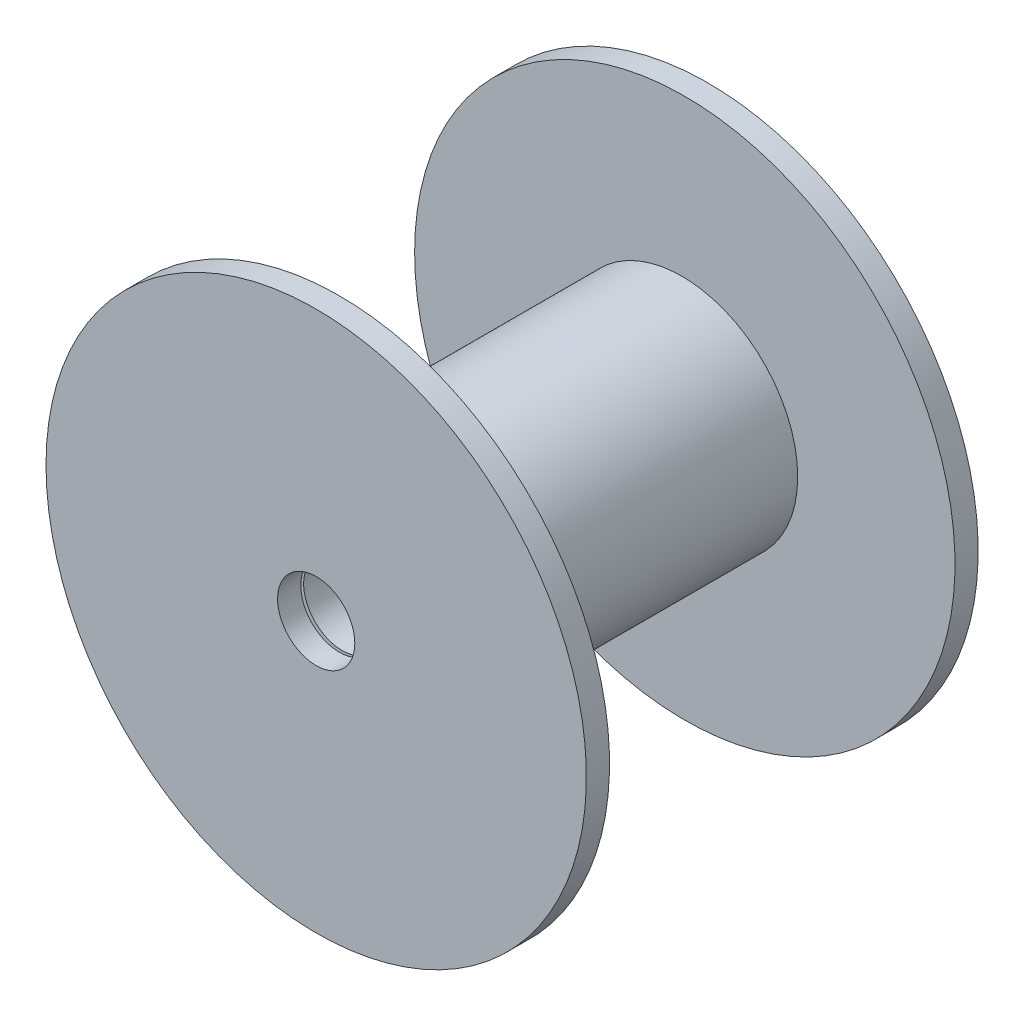
ISO-10303-21;
HEADER;
FILE_DESCRIPTION(('STEP AP214'),'2;1');
FILE_NAME('part.step','',(''),(''),'','','');
FILE_SCHEMA(('AUTOMOTIVE_DESIGN { 1 0 10303 214 1 1 1 1 }'));
ENDSEC;
DATA;
#1=APPLICATION_CONTEXT('core data for automotive mechanical design processes');
#2=APPLICATION_PROTOCOL_DEFINITION('international standard','automotive_design',2000,#1);
#3=PRODUCT_CONTEXT('',#1,'mechanical');
#4=PRODUCT('Part','Part','',(#3));
#5=PRODUCT_RELATED_PRODUCT_CATEGORY('part','',(#4));
#6=PRODUCT_DEFINITION_FORMATION('','',#4);
#7=PRODUCT_DEFINITION_CONTEXT('part definition',#1,'design');
#8=PRODUCT_DEFINITION('design','',#6,#7);
#9=PRODUCT_DEFINITION_SHAPE('','',#8);
#10=(LENGTH_UNIT() NAMED_UNIT(*) SI_UNIT(.MILLI.,.METRE.));
#11=(NAMED_UNIT(*) PLANE_ANGLE_UNIT() SI_UNIT($,.RADIAN.));
#12=(NAMED_UNIT(*) SI_UNIT($,.STERADIAN.) SOLID_ANGLE_UNIT());
#13=UNCERTAINTY_MEASURE_WITH_UNIT(LENGTH_MEASURE(1.E-05),#10,'distance_accuracy_value','');
#14=(GEOMETRIC_REPRESENTATION_CONTEXT(3) GLOBAL_UNCERTAINTY_ASSIGNED_CONTEXT((#13)) GLOBAL_UNIT_ASSIGNED_CONTEXT((#10,
#11,#12)) REPRESENTATION_CONTEXT('',''));
#15=CARTESIAN_POINT('',(0.,0.,0.));
#16=DIRECTION('',(0.,0.,1.));
#17=DIRECTION('',(1.,0.,0.));
#18=AXIS2_PLACEMENT_3D('',#15,#16,#17);
#19=CARTESIAN_POINT('',(0.,35.,44.3746812291641));
#20=DIRECTION('',(0.,0.,1.));
#21=DIRECTION('',(1.,0.,0.));
#22=AXIS2_PLACEMENT_3D('',#19,#20,#21);
#23=PLANE('',#22);
#24=CARTESIAN_POINT('',(0.,0.,44.3746812291641));
#25=DIRECTION('',(0.,0.,1.));
#26=DIRECTION('',(1.,0.,0.));
#27=AXIS2_PLACEMENT_3D('',#24,#25,#26);
#28=CIRCLE('',#27,5.);
#29=CARTESIAN_POINT('',(5.,0.,44.3746812291641));
#30=VERTEX_POINT('',#29);
#31=EDGE_CURVE('E63',#30,#30,#28,.T.);
#32=ORIENTED_EDGE('',*,*,#31,.T.);
#33=EDGE_LOOP('',(#32));
#34=FACE_BOUND('',#33,.T.);
#35=CARTESIAN_POINT('',(0.,0.,44.3746812291641));
#36=DIRECTION('',(0.,0.,-1.));
#37=DIRECTION('',(-1.,0.,0.));
#38=AXIS2_PLACEMENT_3D('',#35,#36,#37);
#39=CIRCLE('',#38,35.);
#40=CARTESIAN_POINT('',(-35.,0.,44.3746812291641));
#41=VERTEX_POINT('',#40);
#42=EDGE_CURVE('E59',#41,#41,#39,.T.);
#43=ORIENTED_EDGE('',*,*,#42,.T.);
#44=EDGE_LOOP('',(#43));
#45=FACE_BOUND('',#44,.T.);
#46=ADVANCED_FACE('F51',(#34,#45),#23,.F.);
#47=CARTESIAN_POINT('',(0.,0.,44.3746812291641));
#48=DIRECTION('',(0.,0.,-1.));
#49=DIRECTION('',(-1.,0.,0.));
#50=AXIS2_PLACEMENT_3D('',#47,#48,#49);
#51=CYLINDRICAL_SURFACE('',#50,35.);
#52=CARTESIAN_POINT('',(0.,0.,47.3746812291641));
#53=DIRECTION('',(0.,0.,-1.));
#54=DIRECTION('',(-1.,0.,0.));
#55=AXIS2_PLACEMENT_3D('',#52,#53,#54);
#56=CIRCLE('',#55,35.);
#57=CARTESIAN_POINT('',(-35.,0.,47.3746812291641));
#58=VERTEX_POINT('',#57);
#59=EDGE_CURVE('E11',#58,#58,#56,.T.);
#60=ORIENTED_EDGE('',*,*,#59,.T.);
#61=EDGE_LOOP('',(#60));
#62=FACE_BOUND('',#61,.T.);
#63=ORIENTED_EDGE('',*,*,#42,.F.);
#64=EDGE_LOOP('',(#63));
#65=FACE_BOUND('',#64,.T.);
#66=ADVANCED_FACE('F77',(#62,#65),#51,.T.);
#67=CARTESIAN_POINT('',(0.,35.,47.3746812291641));
#68=DIRECTION('',(0.,0.,1.));
#69=DIRECTION('',(1.,0.,0.));
#70=AXIS2_PLACEMENT_3D('',#67,#68,#69);
#71=PLANE('',#70);
#72=CARTESIAN_POINT('',(0.,0.,47.3746812291641));
#73=DIRECTION('',(0.,0.,1.));
#74=DIRECTION('',(1.,0.,0.));
#75=AXIS2_PLACEMENT_3D('',#72,#73,#74);
#76=CIRCLE('',#75,5.);
#77=CARTESIAN_POINT('',(5.,0.,47.3746812291641));
#78=VERTEX_POINT('',#77);
#79=EDGE_CURVE('E55',#78,#78,#76,.T.);
#80=ORIENTED_EDGE('',*,*,#79,.F.);
#81=EDGE_LOOP('',(#80));
#82=FACE_BOUND('',#81,.T.);
#83=ORIENTED_EDGE('',*,*,#59,.F.);
#84=EDGE_LOOP('',(#83));
#85=FACE_BOUND('',#84,.T.);
#86=ADVANCED_FACE('F53',(#82,#85),#71,.T.);
#87=CARTESIAN_POINT('',(0.,0.,-44.));
#88=DIRECTION('',(0.,0.,1.));
#89=DIRECTION('',(1.,0.,0.));
#90=AXIS2_PLACEMENT_3D('',#87,#88,#89);
#91=CYLINDRICAL_SURFACE('',#90,5.);
#92=ORIENTED_EDGE('',*,*,#79,.T.);
#93=EDGE_LOOP('',(#92));
#94=FACE_BOUND('',#93,.T.);
#95=ORIENTED_EDGE('',*,*,#31,.F.);
#96=EDGE_LOOP('',(#95));
#97=FACE_BOUND('',#96,.T.);
#98=ADVANCED_FACE('F72',(#94,#97),#91,.F.);
#99=CLOSED_SHELL('',(#46,#66,#86,#98));
#100=MANIFOLD_SOLID_BREP('B2',#99);
#101=CARTESIAN_POINT('',(0.,0.,44.3746812291641));
#102=DIRECTION('',(0.,0.,-1.));
#103=DIRECTION('',(-1.,0.,0.));
#104=AXIS2_PLACEMENT_3D('',#101,#102,#103);
#105=CYLINDRICAL_SURFACE('',#104,35.);
#106=CARTESIAN_POINT('',(0.,0.,-3.37468122916413));
#107=DIRECTION('',(0.,0.,-1.));
#108=DIRECTION('',(-1.,0.,0.));
#109=AXIS2_PLACEMENT_3D('',#106,#107,#108);
#110=CIRCLE('',#109,35.);
#111=CARTESIAN_POINT('',(-35.,0.,-3.37468122916413));
#112=VERTEX_POINT('',#111);
#113=EDGE_CURVE('E133',#112,#112,#110,.T.);
#114=ORIENTED_EDGE('',*,*,#113,.F.);
#115=EDGE_LOOP('',(#114));
#116=FACE_BOUND('',#115,.T.);
#117=CARTESIAN_POINT('',(0.,0.,-0.374681229164127));
#118=DIRECTION('',(0.,0.,-1.));
#119=DIRECTION('',(-1.,0.,0.));
#120=AXIS2_PLACEMENT_3D('',#117,#118,#119);
#121=CIRCLE('',#120,35.);
#122=CARTESIAN_POINT('',(-35.,0.,-0.374681229164127));
#123=VERTEX_POINT('',#122);
#124=EDGE_CURVE('E50',#123,#123,#121,.T.);
#125=ORIENTED_EDGE('',*,*,#124,.T.);
#126=EDGE_LOOP('',(#125));
#127=FACE_BOUND('',#126,.T.);
#128=ADVANCED_FACE('F127',(#116,#127),#105,.T.);
#129=CARTESIAN_POINT('',(0.,0.,-0.374681229164123));
#130=DIRECTION('',(0.,0.,1.));
#131=DIRECTION('',(1.,0.,0.));
#132=AXIS2_PLACEMENT_3D('',#129,#130,#131);
#133=PLANE('',#132);
#134=CARTESIAN_POINT('',(0.,0.,-0.374681229164127));
#135=DIRECTION('',(0.,0.,1.));
#136=DIRECTION('',(1.,0.,0.));
#137=AXIS2_PLACEMENT_3D('',#134,#135,#136);
#138=CIRCLE('',#137,5.);
#139=CARTESIAN_POINT('',(5.,0.,-0.374681229164127));
#140=VERTEX_POINT('',#139);
#141=EDGE_CURVE('E137',#140,#140,#138,.T.);
#142=ORIENTED_EDGE('',*,*,#141,.F.);
#143=EDGE_LOOP('',(#142));
#144=FACE_BOUND('',#143,.T.);
#145=ORIENTED_EDGE('',*,*,#124,.F.);
#146=EDGE_LOOP('',(#145));
#147=FACE_BOUND('',#146,.T.);
#148=ADVANCED_FACE('F151',(#144,#147),#133,.T.);
#149=CARTESIAN_POINT('',(0.,0.,-3.37468122916412));
#150=DIRECTION('',(0.,0.,1.));
#151=DIRECTION('',(1.,0.,0.));
#152=AXIS2_PLACEMENT_3D('',#149,#150,#151);
#153=PLANE('',#152);
#154=CARTESIAN_POINT('',(0.,0.,-3.37468122916412));
#155=DIRECTION('',(0.,0.,-1.));
#156=DIRECTION('',(-1.,0.,0.));
#157=AXIS2_PLACEMENT_3D('',#154,#155,#156);
#158=CIRCLE('',#157,5.);
#159=CARTESIAN_POINT('',(-5.,0.,-3.37468122916412));
#160=VERTEX_POINT('',#159);
#161=EDGE_CURVE('E141',#160,#160,#158,.T.);
#162=ORIENTED_EDGE('',*,*,#161,.F.);
#163=EDGE_LOOP('',(#162));
#164=FACE_BOUND('',#163,.T.);
#165=ORIENTED_EDGE('',*,*,#113,.T.);
#166=EDGE_LOOP('',(#165));
#167=FACE_BOUND('',#166,.T.);
#168=ADVANCED_FACE('F149',(#164,#167),#153,.F.);
#169=CARTESIAN_POINT('',(0.,0.,47.3746812291641));
#170=DIRECTION('',(0.,0.,-1.));
#171=DIRECTION('',(-1.,0.,0.));
#172=AXIS2_PLACEMENT_3D('',#169,#170,#171);
#173=CYLINDRICAL_SURFACE('',#172,5.);
#174=ORIENTED_EDGE('',*,*,#141,.T.);
#175=EDGE_LOOP('',(#174));
#176=FACE_BOUND('',#175,.T.);
#177=ORIENTED_EDGE('',*,*,#161,.T.);
#178=EDGE_LOOP('',(#177));
#179=FACE_BOUND('',#178,.T.);
#180=ADVANCED_FACE('F147',(#176,#179),#173,.F.);
#181=CLOSED_SHELL('',(#128,#148,#168,#180));
#182=MANIFOLD_SOLID_BREP('B6',#181);
#183=CARTESIAN_POINT('',(0.,0.,44.));
#184=DIRECTION('',(0.,0.,-1.));
#185=DIRECTION('',(-1.,0.,0.));
#186=AXIS2_PLACEMENT_3D('',#183,#184,#185);
#187=CYLINDRICAL_SURFACE('',#186,5.);
#188=CARTESIAN_POINT('',(0.,0.,44.));
#189=DIRECTION('',(0.,0.,1.));
#190=DIRECTION('',(1.,0.,0.));
#191=AXIS2_PLACEMENT_3D('',#188,#189,#190);
#192=CIRCLE('',#191,5.);
#193=CARTESIAN_POINT('',(5.,0.,44.));
#194=VERTEX_POINT('',#193);
#195=EDGE_CURVE('E205',#194,#194,#192,.T.);
#196=ORIENTED_EDGE('',*,*,#195,.T.);
#197=EDGE_LOOP('',(#196));
#198=FACE_BOUND('',#197,.T.);
#199=CARTESIAN_POINT('',(0.,0.,0.));
#200=DIRECTION('',(0.,0.,1.));
#201=DIRECTION('',(1.,0.,0.));
#202=AXIS2_PLACEMENT_3D('',#199,#200,#201);
#203=CIRCLE('',#202,5.);
#204=CARTESIAN_POINT('',(5.,0.,0.));
#205=VERTEX_POINT('',#204);
#206=EDGE_CURVE('E212',#205,#205,#203,.T.);
#207=ORIENTED_EDGE('',*,*,#206,.F.);
#208=EDGE_LOOP('',(#207));
#209=FACE_BOUND('',#208,.T.);
#210=ADVANCED_FACE('F197',(#198,#209),#187,.F.);
#211=CARTESIAN_POINT('',(0.,0.,44.));
#212=DIRECTION('',(0.,0.,-1.));
#213=DIRECTION('',(-1.,0.,0.));
#214=AXIS2_PLACEMENT_3D('',#211,#212,#213);
#215=CYLINDRICAL_SURFACE('',#214,15.);
#216=CARTESIAN_POINT('',(0.,0.,44.));
#217=DIRECTION('',(0.,0.,1.));
#218=DIRECTION('',(1.,0.,0.));
#219=AXIS2_PLACEMENT_3D('',#216,#217,#218);
#220=CIRCLE('',#219,15.);
#221=CARTESIAN_POINT('',(15.,0.,44.));
#222=VERTEX_POINT('',#221);
#223=EDGE_CURVE('E126',#222,#222,#220,.T.);
#224=ORIENTED_EDGE('',*,*,#223,.F.);
#225=EDGE_LOOP('',(#224));
#226=FACE_BOUND('',#225,.T.);
#227=CARTESIAN_POINT('',(0.,0.,0.));
#228=DIRECTION('',(0.,0.,1.));
#229=DIRECTION('',(1.,0.,0.));
#230=AXIS2_PLACEMENT_3D('',#227,#228,#229);
#231=CIRCLE('',#230,15.);
#232=CARTESIAN_POINT('',(15.,0.,0.));
#233=VERTEX_POINT('',#232);
#234=EDGE_CURVE('E200',#233,#233,#231,.T.);
#235=ORIENTED_EDGE('',*,*,#234,.T.);
#236=EDGE_LOOP('',(#235));
#237=FACE_BOUND('',#236,.T.);
#238=ADVANCED_FACE('F221',(#226,#237),#215,.T.);
#239=CARTESIAN_POINT('',(0.,0.,44.));
#240=DIRECTION('',(0.,0.,1.));
#241=DIRECTION('',(1.,0.,0.));
#242=AXIS2_PLACEMENT_3D('',#239,#240,#241);
#243=PLANE('',#242);
#244=ORIENTED_EDGE('',*,*,#195,.F.);
#245=EDGE_LOOP('',(#244));
#246=FACE_BOUND('',#245,.T.);
#247=ORIENTED_EDGE('',*,*,#223,.T.);
#248=EDGE_LOOP('',(#247));
#249=FACE_BOUND('',#248,.T.);
#250=ADVANCED_FACE('F225',(#246,#249),#243,.T.);
#251=CARTESIAN_POINT('',(0.,0.,0.));
#252=DIRECTION('',(0.,0.,1.));
#253=DIRECTION('',(1.,0.,0.));
#254=AXIS2_PLACEMENT_3D('',#251,#252,#253);
#255=PLANE('',#254);
#256=ORIENTED_EDGE('',*,*,#206,.T.);
#257=EDGE_LOOP('',(#256));
#258=FACE_BOUND('',#257,.T.);
#259=ORIENTED_EDGE('',*,*,#234,.F.);
#260=EDGE_LOOP('',(#259));
#261=FACE_BOUND('',#260,.T.);
#262=ADVANCED_FACE('F223',(#258,#261),#255,.F.);
#263=CLOSED_SHELL('',(#210,#238,#250,#262));
#264=MANIFOLD_SOLID_BREP('B45',#263);
#265=ADVANCED_BREP_SHAPE_REPRESENTATION('',(#18,#100,#182,#264),#14);
#266=SHAPE_DEFINITION_REPRESENTATION(#9,#265);
ENDSEC;
END-ISO-10303-21;
